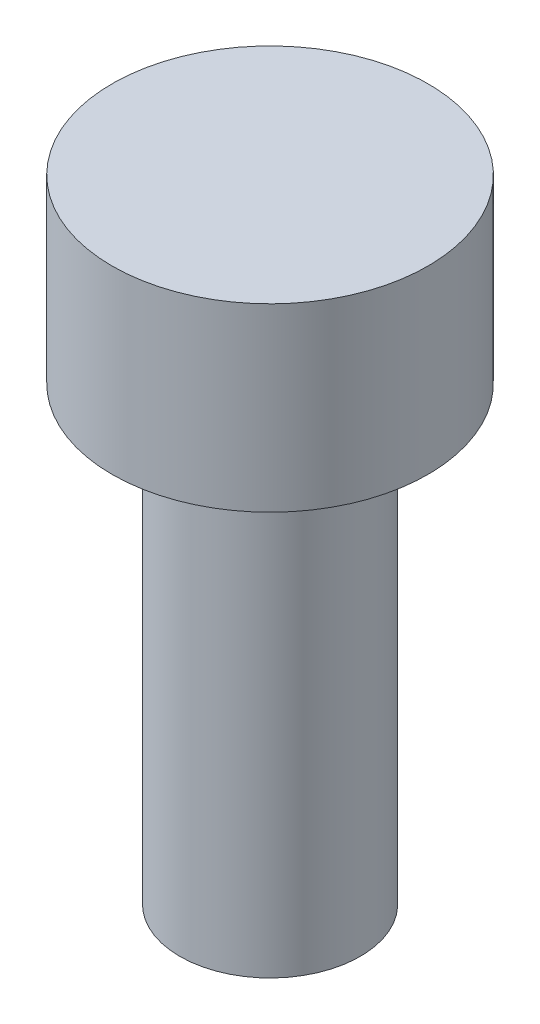
ISO-10303-21;
HEADER;
FILE_DESCRIPTION(('STEP AP214'),'2;1');
FILE_NAME('part.step','',(''),(''),'','','');
FILE_SCHEMA(('AUTOMOTIVE_DESIGN { 1 0 10303 214 1 1 1 1 }'));
ENDSEC;
DATA;
#1=APPLICATION_CONTEXT('core data for automotive mechanical design processes');
#2=APPLICATION_PROTOCOL_DEFINITION('international standard','automotive_design',2000,#1);
#3=PRODUCT_CONTEXT('',#1,'mechanical');
#4=PRODUCT('Part','Part','',(#3));
#5=PRODUCT_RELATED_PRODUCT_CATEGORY('part','',(#4));
#6=PRODUCT_DEFINITION_FORMATION('','',#4);
#7=PRODUCT_DEFINITION_CONTEXT('part definition',#1,'design');
#8=PRODUCT_DEFINITION('design','',#6,#7);
#9=PRODUCT_DEFINITION_SHAPE('','',#8);
#10=(LENGTH_UNIT() NAMED_UNIT(*) SI_UNIT(.MILLI.,.METRE.));
#11=(NAMED_UNIT(*) PLANE_ANGLE_UNIT() SI_UNIT($,.RADIAN.));
#12=(NAMED_UNIT(*) SI_UNIT($,.STERADIAN.) SOLID_ANGLE_UNIT());
#13=UNCERTAINTY_MEASURE_WITH_UNIT(LENGTH_MEASURE(1.E-05),#10,'distance_accuracy_value','');
#14=(GEOMETRIC_REPRESENTATION_CONTEXT(3) GLOBAL_UNCERTAINTY_ASSIGNED_CONTEXT((#13)) GLOBAL_UNIT_ASSIGNED_CONTEXT((#10,
#11,#12)) REPRESENTATION_CONTEXT('',''));
#15=CARTESIAN_POINT('',(0.,0.,0.));
#16=DIRECTION('',(0.,0.,1.));
#17=DIRECTION('',(1.,0.,0.));
#18=AXIS2_PLACEMENT_3D('',#15,#16,#17);
#19=CARTESIAN_POINT('',(0.,10.,0.));
#20=DIRECTION('',(0.,-1.,0.));
#21=DIRECTION('',(0.,0.,-1.));
#22=AXIS2_PLACEMENT_3D('',#19,#20,#21);
#23=CYLINDRICAL_SURFACE('',#22,2.);
#24=CARTESIAN_POINT('',(0.,10.,0.));
#25=DIRECTION('',(0.,1.,0.));
#26=DIRECTION('',(0.,0.,1.));
#27=AXIS2_PLACEMENT_3D('',#24,#25,#26);
#28=CIRCLE('',#27,2.);
#29=CARTESIAN_POINT('',(0.,10.,2.));
#30=VERTEX_POINT('',#29);
#31=EDGE_CURVE('E10',#30,#30,#28,.T.);
#32=ORIENTED_EDGE('',*,*,#31,.F.);
#33=EDGE_LOOP('',(#32));
#34=FACE_BOUND('',#33,.T.);
#35=CARTESIAN_POINT('',(0.,0.,0.));
#36=DIRECTION('',(0.,1.,0.));
#37=DIRECTION('',(0.,0.,1.));
#38=AXIS2_PLACEMENT_3D('',#35,#36,#37);
#39=CIRCLE('',#38,2.);
#40=CARTESIAN_POINT('',(0.,0.,2.));
#41=VERTEX_POINT('',#40);
#42=EDGE_CURVE('E34',#41,#41,#39,.T.);
#43=ORIENTED_EDGE('',*,*,#42,.T.);
#44=EDGE_LOOP('',(#43));
#45=FACE_BOUND('',#44,.T.);
#46=ADVANCED_FACE('F31',(#34,#45),#23,.T.);
#47=CARTESIAN_POINT('',(0.,0.,0.));
#48=DIRECTION('',(0.,1.,0.));
#49=DIRECTION('',(0.,0.,1.));
#50=AXIS2_PLACEMENT_3D('',#47,#48,#49);
#51=PLANE('',#50);
#52=ORIENTED_EDGE('',*,*,#42,.F.);
#53=EDGE_LOOP('',(#52));
#54=FACE_BOUND('',#53,.T.);
#55=ADVANCED_FACE('F54',(#54),#51,.F.);
#56=CARTESIAN_POINT('',(0.,14.,0.));
#57=DIRECTION('',(0.,-1.,0.));
#58=DIRECTION('',(0.,0.,-1.));
#59=AXIS2_PLACEMENT_3D('',#56,#57,#58);
#60=CYLINDRICAL_SURFACE('',#59,3.5);
#61=CARTESIAN_POINT('',(0.,14.,0.));
#62=DIRECTION('',(0.,1.,0.));
#63=DIRECTION('',(0.,0.,1.));
#64=AXIS2_PLACEMENT_3D('',#61,#62,#63);
#65=CIRCLE('',#64,3.5);
#66=CARTESIAN_POINT('',(0.,14.,3.5));
#67=VERTEX_POINT('',#66);
#68=EDGE_CURVE('E41',#67,#67,#65,.T.);
#69=ORIENTED_EDGE('',*,*,#68,.F.);
#70=EDGE_LOOP('',(#69));
#71=FACE_BOUND('',#70,.T.);
#72=CARTESIAN_POINT('',(0.,10.,0.));
#73=DIRECTION('',(0.,1.,0.));
#74=DIRECTION('',(0.,0.,1.));
#75=AXIS2_PLACEMENT_3D('',#72,#73,#74);
#76=CIRCLE('',#75,3.5);
#77=CARTESIAN_POINT('',(0.,10.,3.5));
#78=VERTEX_POINT('',#77);
#79=EDGE_CURVE('E43',#78,#78,#76,.T.);
#80=ORIENTED_EDGE('',*,*,#79,.T.);
#81=EDGE_LOOP('',(#80));
#82=FACE_BOUND('',#81,.T.);
#83=ADVANCED_FACE('F51',(#71,#82),#60,.T.);
#84=CARTESIAN_POINT('',(0.,14.,0.));
#85=DIRECTION('',(0.,1.,0.));
#86=DIRECTION('',(0.,0.,1.));
#87=AXIS2_PLACEMENT_3D('',#84,#85,#86);
#88=PLANE('',#87);
#89=ORIENTED_EDGE('',*,*,#68,.T.);
#90=EDGE_LOOP('',(#89));
#91=FACE_BOUND('',#90,.T.);
#92=ADVANCED_FACE('F49',(#91),#88,.T.);
#93=CARTESIAN_POINT('',(0.,10.,0.));
#94=DIRECTION('',(0.,1.,0.));
#95=DIRECTION('',(0.,0.,1.));
#96=AXIS2_PLACEMENT_3D('',#93,#94,#95);
#97=PLANE('',#96);
#98=ORIENTED_EDGE('',*,*,#31,.T.);
#99=EDGE_LOOP('',(#98));
#100=FACE_BOUND('',#99,.T.);
#101=ORIENTED_EDGE('',*,*,#79,.F.);
#102=EDGE_LOOP('',(#101));
#103=FACE_BOUND('',#102,.T.);
#104=ADVANCED_FACE('F58',(#100,#103),#97,.F.);
#105=CLOSED_SHELL('',(#46,#55,#83,#92,#104));
#106=MANIFOLD_SOLID_BREP('B2',#105);
#107=ADVANCED_BREP_SHAPE_REPRESENTATION('',(#18,#106),#14);
#108=SHAPE_DEFINITION_REPRESENTATION(#9,#107);
ENDSEC;
END-ISO-10303-21;
